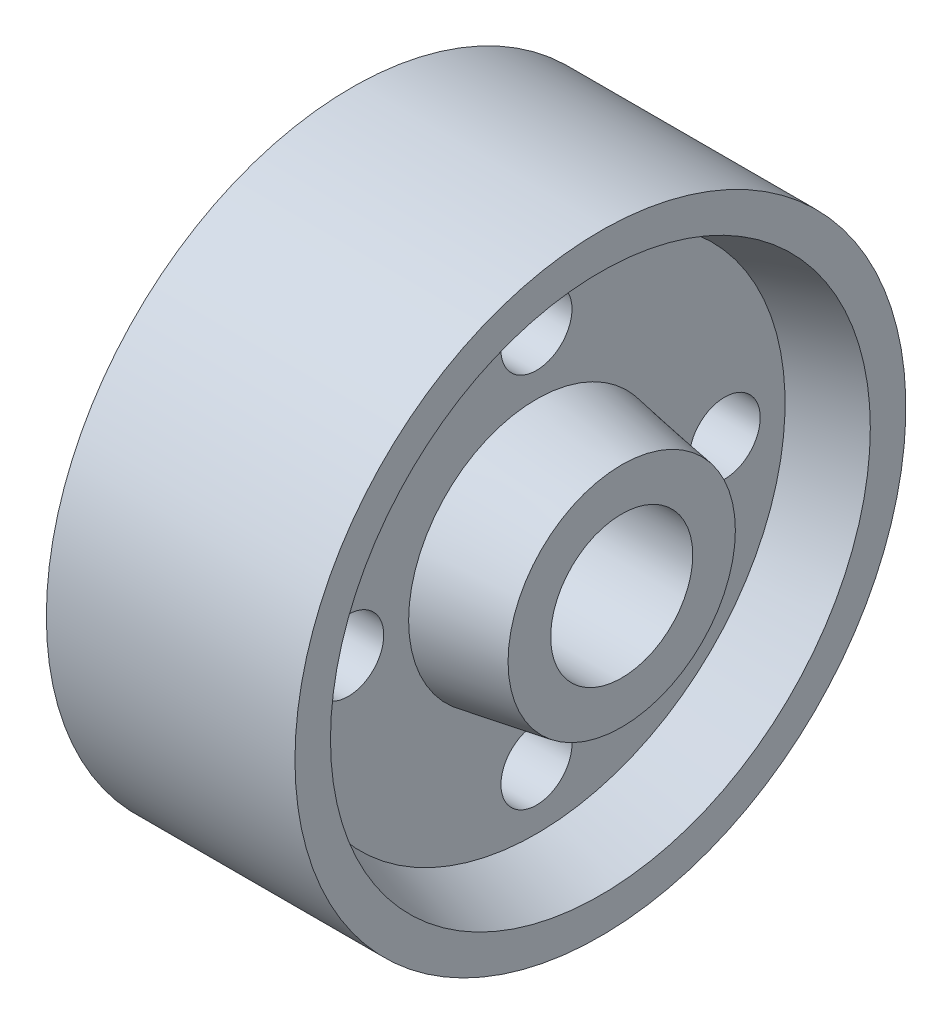
ISO-10303-21;
HEADER;
FILE_DESCRIPTION(('STEP AP214'),'2;1');
FILE_NAME('part.step','',(''),(''),'','','');
FILE_SCHEMA(('AUTOMOTIVE_DESIGN { 1 0 10303 214 1 1 1 1 }'));
ENDSEC;
DATA;
#1=APPLICATION_CONTEXT('core data for automotive mechanical design processes');
#2=APPLICATION_PROTOCOL_DEFINITION('international standard','automotive_design',2000,#1);
#3=PRODUCT_CONTEXT('',#1,'mechanical');
#4=PRODUCT('Part','Part','',(#3));
#5=PRODUCT_RELATED_PRODUCT_CATEGORY('part','',(#4));
#6=PRODUCT_DEFINITION_FORMATION('','',#4);
#7=PRODUCT_DEFINITION_CONTEXT('part definition',#1,'design');
#8=PRODUCT_DEFINITION('design','',#6,#7);
#9=PRODUCT_DEFINITION_SHAPE('','',#8);
#10=(LENGTH_UNIT() NAMED_UNIT(*) SI_UNIT(.MILLI.,.METRE.));
#11=(NAMED_UNIT(*) PLANE_ANGLE_UNIT() SI_UNIT($,.RADIAN.));
#12=(NAMED_UNIT(*) SI_UNIT($,.STERADIAN.) SOLID_ANGLE_UNIT());
#13=UNCERTAINTY_MEASURE_WITH_UNIT(LENGTH_MEASURE(1.E-05),#10,'distance_accuracy_value','');
#14=(GEOMETRIC_REPRESENTATION_CONTEXT(3) GLOBAL_UNCERTAINTY_ASSIGNED_CONTEXT((#13)) GLOBAL_UNIT_ASSIGNED_CONTEXT((#10,
#11,#12)) REPRESENTATION_CONTEXT('',''));
#15=CARTESIAN_POINT('',(0.,0.,0.));
#16=DIRECTION('',(0.,0.,1.));
#17=DIRECTION('',(1.,0.,0.));
#18=AXIS2_PLACEMENT_3D('',#15,#16,#17);
#19=CARTESIAN_POINT('',(41.,0.,0.));
#20=DIRECTION('',(-1.,0.,0.));
#21=DIRECTION('',(0.,0.,1.));
#22=AXIS2_PLACEMENT_3D('',#19,#20,#21);
#23=PLANE('',#22);
#24=CARTESIAN_POINT('',(41.,0.,0.));
#25=DIRECTION('',(1.,0.,0.));
#26=DIRECTION('',(0.,0.,-1.));
#27=AXIS2_PLACEMENT_3D('',#24,#25,#26);
#28=CIRCLE('',#27,10.);
#29=CARTESIAN_POINT('',(41.,0.,-10.));
#30=VERTEX_POINT('',#29);
#31=EDGE_CURVE('E174',#30,#30,#28,.T.);
#32=ORIENTED_EDGE('',*,*,#31,.F.);
#33=EDGE_LOOP('',(#32));
#34=FACE_BOUND('',#33,.T.);
#35=CARTESIAN_POINT('',(41.,0.,0.));
#36=DIRECTION('',(-1.,0.,0.));
#37=DIRECTION('',(0.,0.,1.));
#38=AXIS2_PLACEMENT_3D('',#35,#36,#37);
#39=CIRCLE('',#38,16.);
#40=CARTESIAN_POINT('',(41.,0.,16.));
#41=VERTEX_POINT('',#40);
#42=EDGE_CURVE('E10',#41,#41,#39,.T.);
#43=ORIENTED_EDGE('',*,*,#42,.F.);
#44=EDGE_LOOP('',(#43));
#45=FACE_BOUND('',#44,.T.);
#46=ADVANCED_FACE('F37',(#34,#45),#23,.F.);
#47=CARTESIAN_POINT('',(41.,0.,0.));
#48=DIRECTION('',(-1.,0.,0.));
#49=DIRECTION('',(0.,0.,1.));
#50=AXIS2_PLACEMENT_3D('',#47,#48,#49);
#51=CONICAL_SURFACE('',#50,16.,0.165148677414627);
#52=CARTESIAN_POINT('',(29.,0.,0.));
#53=DIRECTION('',(-1.,0.,0.));
#54=DIRECTION('',(0.,0.,1.));
#55=AXIS2_PLACEMENT_3D('',#52,#53,#54);
#56=CIRCLE('',#55,18.);
#57=CARTESIAN_POINT('',(29.,0.,18.));
#58=VERTEX_POINT('',#57);
#59=EDGE_CURVE('E44',#58,#58,#56,.T.);
#60=ORIENTED_EDGE('',*,*,#59,.F.);
#61=EDGE_LOOP('',(#60));
#62=FACE_BOUND('',#61,.T.);
#63=ORIENTED_EDGE('',*,*,#42,.T.);
#64=EDGE_LOOP('',(#63));
#65=FACE_BOUND('',#64,.T.);
#66=ADVANCED_FACE('F106',(#62,#65),#51,.T.);
#67=CARTESIAN_POINT('',(29.,0.,-18.));
#68=DIRECTION('',(-1.,0.,0.));
#69=DIRECTION('',(0.,0.,1.));
#70=AXIS2_PLACEMENT_3D('',#67,#68,#69);
#71=PLANE('',#70);
#72=CARTESIAN_POINT('',(29.,26.5,0.));
#73=DIRECTION('',(-1.,0.,0.));
#74=DIRECTION('',(0.,0.,1.));
#75=AXIS2_PLACEMENT_3D('',#72,#73,#74);
#76=CIRCLE('',#75,5.);
#77=CARTESIAN_POINT('',(29.,26.5,5.));
#78=VERTEX_POINT('',#77);
#79=EDGE_CURVE('E75',#78,#78,#76,.T.);
#80=ORIENTED_EDGE('',*,*,#79,.T.);
#81=EDGE_LOOP('',(#80));
#82=FACE_BOUND('',#81,.T.);
#83=CARTESIAN_POINT('',(29.,0.,-26.5));
#84=DIRECTION('',(-1.,0.,0.));
#85=DIRECTION('',(0.,0.,1.));
#86=AXIS2_PLACEMENT_3D('',#83,#84,#85);
#87=CIRCLE('',#86,4.99999999999992);
#88=CARTESIAN_POINT('',(29.,0.,-21.5000000000001));
#89=VERTEX_POINT('',#88);
#90=EDGE_CURVE('E63',#89,#89,#87,.T.);
#91=ORIENTED_EDGE('',*,*,#90,.T.);
#92=EDGE_LOOP('',(#91));
#93=FACE_BOUND('',#92,.T.);
#94=CARTESIAN_POINT('',(29.,-26.5,0.));
#95=DIRECTION('',(-1.,0.,0.));
#96=DIRECTION('',(0.,0.,1.));
#97=AXIS2_PLACEMENT_3D('',#94,#95,#96);
#98=CIRCLE('',#97,5.);
#99=CARTESIAN_POINT('',(29.,-26.5,4.99999999999999));
#100=VERTEX_POINT('',#99);
#101=EDGE_CURVE('E60',#100,#100,#98,.T.);
#102=ORIENTED_EDGE('',*,*,#101,.T.);
#103=EDGE_LOOP('',(#102));
#104=FACE_BOUND('',#103,.T.);
#105=CARTESIAN_POINT('',(29.,0.,26.5));
#106=DIRECTION('',(-1.,0.,0.));
#107=DIRECTION('',(0.,0.,1.));
#108=AXIS2_PLACEMENT_3D('',#105,#106,#107);
#109=CIRCLE('',#108,5.);
#110=CARTESIAN_POINT('',(29.,0.,31.5));
#111=VERTEX_POINT('',#110);
#112=EDGE_CURVE('E56',#111,#111,#109,.T.);
#113=ORIENTED_EDGE('',*,*,#112,.T.);
#114=EDGE_LOOP('',(#113));
#115=FACE_BOUND('',#114,.T.);
#116=CARTESIAN_POINT('',(29.,0.,0.));
#117=DIRECTION('',(-1.,0.,0.));
#118=DIRECTION('',(0.,0.,1.));
#119=AXIS2_PLACEMENT_3D('',#116,#117,#118);
#120=CIRCLE('',#119,35.);
#121=CARTESIAN_POINT('',(29.,0.,35.));
#122=VERTEX_POINT('',#121);
#123=EDGE_CURVE('E49',#122,#122,#120,.T.);
#124=ORIENTED_EDGE('',*,*,#123,.F.);
#125=EDGE_LOOP('',(#124));
#126=FACE_BOUND('',#125,.T.);
#127=ORIENTED_EDGE('',*,*,#59,.T.);
#128=EDGE_LOOP('',(#127));
#129=FACE_BOUND('',#128,.T.);
#130=ADVANCED_FACE('F103',(#82,#93,#104,#115,#126,#129),#71,.F.);
#131=CARTESIAN_POINT('',(29.,0.,0.));
#132=DIRECTION('',(1.,0.,0.));
#133=DIRECTION('',(0.,0.,-1.));
#134=AXIS2_PLACEMENT_3D('',#131,#132,#133);
#135=CONICAL_SURFACE('',#134,35.,0.321750554396642);
#136=CARTESIAN_POINT('',(38.,0.,0.));
#137=DIRECTION('',(-1.,0.,0.));
#138=DIRECTION('',(0.,0.,1.));
#139=AXIS2_PLACEMENT_3D('',#136,#137,#138);
#140=CIRCLE('',#139,38.);
#141=CARTESIAN_POINT('',(38.,0.,38.));
#142=VERTEX_POINT('',#141);
#143=EDGE_CURVE('E96',#142,#142,#140,.T.);
#144=ORIENTED_EDGE('',*,*,#143,.F.);
#145=EDGE_LOOP('',(#144));
#146=FACE_BOUND('',#145,.T.);
#147=ORIENTED_EDGE('',*,*,#123,.T.);
#148=EDGE_LOOP('',(#147));
#149=FACE_BOUND('',#148,.T.);
#150=ADVANCED_FACE('F101',(#146,#149),#135,.F.);
#151=CARTESIAN_POINT('',(38.,0.,-38.));
#152=DIRECTION('',(-1.,0.,0.));
#153=DIRECTION('',(0.,0.,1.));
#154=AXIS2_PLACEMENT_3D('',#151,#152,#153);
#155=PLANE('',#154);
#156=CARTESIAN_POINT('',(38.,0.,0.));
#157=DIRECTION('',(-1.,0.,0.));
#158=DIRECTION('',(0.,0.,1.));
#159=AXIS2_PLACEMENT_3D('',#156,#157,#158);
#160=CIRCLE('',#159,43.);
#161=CARTESIAN_POINT('',(38.,0.,43.));
#162=VERTEX_POINT('',#161);
#163=EDGE_CURVE('E93',#162,#162,#160,.T.);
#164=ORIENTED_EDGE('',*,*,#163,.F.);
#165=EDGE_LOOP('',(#164));
#166=FACE_BOUND('',#165,.T.);
#167=ORIENTED_EDGE('',*,*,#143,.T.);
#168=EDGE_LOOP('',(#167));
#169=FACE_BOUND('',#168,.T.);
#170=ADVANCED_FACE('F119',(#166,#169),#155,.F.);
#171=CARTESIAN_POINT('',(0.,0.,0.));
#172=DIRECTION('',(-1.,0.,0.));
#173=DIRECTION('',(0.,0.,1.));
#174=AXIS2_PLACEMENT_3D('',#171,#172,#173);
#175=CYLINDRICAL_SURFACE('',#174,43.);
#176=CARTESIAN_POINT('',(3.,0.,0.));
#177=DIRECTION('',(-1.,0.,0.));
#178=DIRECTION('',(0.,0.,1.));
#179=AXIS2_PLACEMENT_3D('',#176,#177,#178);
#180=CIRCLE('',#179,43.);
#181=CARTESIAN_POINT('',(3.,0.,43.));
#182=VERTEX_POINT('',#181);
#183=EDGE_CURVE('E90',#182,#182,#180,.T.);
#184=ORIENTED_EDGE('',*,*,#183,.F.);
#185=EDGE_LOOP('',(#184));
#186=FACE_BOUND('',#185,.T.);
#187=ORIENTED_EDGE('',*,*,#163,.T.);
#188=EDGE_LOOP('',(#187));
#189=FACE_BOUND('',#188,.T.);
#190=ADVANCED_FACE('F123',(#186,#189),#175,.T.);
#191=CARTESIAN_POINT('',(3.,0.,-38.));
#192=DIRECTION('',(1.,0.,0.));
#193=DIRECTION('',(0.,0.,-1.));
#194=AXIS2_PLACEMENT_3D('',#191,#192,#193);
#195=PLANE('',#194);
#196=CARTESIAN_POINT('',(3.,0.,0.));
#197=DIRECTION('',(-1.,0.,0.));
#198=DIRECTION('',(0.,0.,1.));
#199=AXIS2_PLACEMENT_3D('',#196,#197,#198);
#200=CIRCLE('',#199,38.);
#201=CARTESIAN_POINT('',(3.,0.,38.));
#202=VERTEX_POINT('',#201);
#203=EDGE_CURVE('E87',#202,#202,#200,.T.);
#204=ORIENTED_EDGE('',*,*,#203,.F.);
#205=EDGE_LOOP('',(#204));
#206=FACE_BOUND('',#205,.T.);
#207=ORIENTED_EDGE('',*,*,#183,.T.);
#208=EDGE_LOOP('',(#207));
#209=FACE_BOUND('',#208,.T.);
#210=ADVANCED_FACE('F127',(#206,#209),#195,.F.);
#211=CARTESIAN_POINT('',(3.,0.,0.));
#212=DIRECTION('',(-1.,0.,0.));
#213=DIRECTION('',(0.,0.,1.));
#214=AXIS2_PLACEMENT_3D('',#211,#212,#213);
#215=CONICAL_SURFACE('',#214,38.,0.321750554396642);
#216=CARTESIAN_POINT('',(12.,0.,0.));
#217=DIRECTION('',(-1.,0.,0.));
#218=DIRECTION('',(0.,0.,1.));
#219=AXIS2_PLACEMENT_3D('',#216,#217,#218);
#220=CIRCLE('',#219,35.);
#221=CARTESIAN_POINT('',(12.,0.,35.));
#222=VERTEX_POINT('',#221);
#223=EDGE_CURVE('E84',#222,#222,#220,.T.);
#224=ORIENTED_EDGE('',*,*,#223,.F.);
#225=EDGE_LOOP('',(#224));
#226=FACE_BOUND('',#225,.T.);
#227=ORIENTED_EDGE('',*,*,#203,.T.);
#228=EDGE_LOOP('',(#227));
#229=FACE_BOUND('',#228,.T.);
#230=ADVANCED_FACE('F131',(#226,#229),#215,.F.);
#231=CARTESIAN_POINT('',(12.,0.,-18.));
#232=DIRECTION('',(1.,0.,0.));
#233=DIRECTION('',(0.,0.,-1.));
#234=AXIS2_PLACEMENT_3D('',#231,#232,#233);
#235=PLANE('',#234);
#236=CARTESIAN_POINT('',(12.,26.5,0.));
#237=DIRECTION('',(1.,0.,0.));
#238=DIRECTION('',(0.,0.,-1.));
#239=AXIS2_PLACEMENT_3D('',#236,#237,#238);
#240=CIRCLE('',#239,5.);
#241=CARTESIAN_POINT('',(12.,26.5,-5.));
#242=VERTEX_POINT('',#241);
#243=EDGE_CURVE('E40',#242,#242,#240,.T.);
#244=ORIENTED_EDGE('',*,*,#243,.T.);
#245=EDGE_LOOP('',(#244));
#246=FACE_BOUND('',#245,.T.);
#247=CARTESIAN_POINT('',(12.,0.,-26.5));
#248=DIRECTION('',(1.,0.,0.));
#249=DIRECTION('',(0.,0.,-1.));
#250=AXIS2_PLACEMENT_3D('',#247,#248,#249);
#251=CIRCLE('',#250,4.99999999999992);
#252=CARTESIAN_POINT('',(12.,0.,-31.4999999999999));
#253=VERTEX_POINT('',#252);
#254=EDGE_CURVE('E61',#253,#253,#251,.T.);
#255=ORIENTED_EDGE('',*,*,#254,.T.);
#256=EDGE_LOOP('',(#255));
#257=FACE_BOUND('',#256,.T.);
#258=CARTESIAN_POINT('',(12.,-26.5,0.));
#259=DIRECTION('',(1.,0.,0.));
#260=DIRECTION('',(0.,0.,-1.));
#261=AXIS2_PLACEMENT_3D('',#258,#259,#260);
#262=CIRCLE('',#261,5.);
#263=CARTESIAN_POINT('',(12.,-26.5,-5.00000000000002));
#264=VERTEX_POINT('',#263);
#265=EDGE_CURVE('E58',#264,#264,#262,.T.);
#266=ORIENTED_EDGE('',*,*,#265,.T.);
#267=EDGE_LOOP('',(#266));
#268=FACE_BOUND('',#267,.T.);
#269=CARTESIAN_POINT('',(12.,0.,26.5));
#270=DIRECTION('',(1.,0.,0.));
#271=DIRECTION('',(0.,0.,-1.));
#272=AXIS2_PLACEMENT_3D('',#269,#270,#271);
#273=CIRCLE('',#272,5.);
#274=CARTESIAN_POINT('',(12.,0.,21.5));
#275=VERTEX_POINT('',#274);
#276=EDGE_CURVE('E53',#275,#275,#273,.T.);
#277=ORIENTED_EDGE('',*,*,#276,.T.);
#278=EDGE_LOOP('',(#277));
#279=FACE_BOUND('',#278,.T.);
#280=CARTESIAN_POINT('',(12.,0.,0.));
#281=DIRECTION('',(-1.,0.,0.));
#282=DIRECTION('',(0.,0.,1.));
#283=AXIS2_PLACEMENT_3D('',#280,#281,#282);
#284=CIRCLE('',#283,18.);
#285=CARTESIAN_POINT('',(12.,0.,18.));
#286=VERTEX_POINT('',#285);
#287=EDGE_CURVE('E81',#286,#286,#284,.T.);
#288=ORIENTED_EDGE('',*,*,#287,.F.);
#289=EDGE_LOOP('',(#288));
#290=FACE_BOUND('',#289,.T.);
#291=ORIENTED_EDGE('',*,*,#223,.T.);
#292=EDGE_LOOP('',(#291));
#293=FACE_BOUND('',#292,.T.);
#294=ADVANCED_FACE('F135',(#246,#257,#268,#279,#290,#293),#235,.F.);
#295=CARTESIAN_POINT('',(12.,0.,0.));
#296=DIRECTION('',(1.,0.,0.));
#297=DIRECTION('',(0.,0.,-1.));
#298=AXIS2_PLACEMENT_3D('',#295,#296,#297);
#299=CONICAL_SURFACE('',#298,18.,0.165148677414627);
#300=CARTESIAN_POINT('',(0.,0.,0.));
#301=DIRECTION('',(-1.,0.,0.));
#302=DIRECTION('',(0.,0.,1.));
#303=AXIS2_PLACEMENT_3D('',#300,#301,#302);
#304=CIRCLE('',#303,16.);
#305=CARTESIAN_POINT('',(0.,0.,16.));
#306=VERTEX_POINT('',#305);
#307=EDGE_CURVE('E78',#306,#306,#304,.T.);
#308=ORIENTED_EDGE('',*,*,#307,.F.);
#309=EDGE_LOOP('',(#308));
#310=FACE_BOUND('',#309,.T.);
#311=ORIENTED_EDGE('',*,*,#287,.T.);
#312=EDGE_LOOP('',(#311));
#313=FACE_BOUND('',#312,.T.);
#314=ADVANCED_FACE('F139',(#310,#313),#299,.T.);
#315=CARTESIAN_POINT('',(0.,0.,0.));
#316=DIRECTION('',(1.,0.,0.));
#317=DIRECTION('',(0.,0.,-1.));
#318=AXIS2_PLACEMENT_3D('',#315,#316,#317);
#319=PLANE('',#318);
#320=CARTESIAN_POINT('',(0.,0.,0.));
#321=DIRECTION('',(1.,0.,0.));
#322=DIRECTION('',(0.,0.,-1.));
#323=AXIS2_PLACEMENT_3D('',#320,#321,#322);
#324=CIRCLE('',#323,10.);
#325=CARTESIAN_POINT('',(0.,0.,-10.));
#326=VERTEX_POINT('',#325);
#327=EDGE_CURVE('E57',#326,#326,#324,.T.);
#328=ORIENTED_EDGE('',*,*,#327,.T.);
#329=EDGE_LOOP('',(#328));
#330=FACE_BOUND('',#329,.T.);
#331=ORIENTED_EDGE('',*,*,#307,.T.);
#332=EDGE_LOOP('',(#331));
#333=FACE_BOUND('',#332,.T.);
#334=ADVANCED_FACE('F143',(#330,#333),#319,.F.);
#335=CARTESIAN_POINT('',(0.,0.,26.5));
#336=DIRECTION('',(1.,0.,0.));
#337=DIRECTION('',(0.,0.,-1.));
#338=AXIS2_PLACEMENT_3D('',#335,#336,#337);
#339=CYLINDRICAL_SURFACE('',#338,5.);
#340=ORIENTED_EDGE('',*,*,#276,.F.);
#341=EDGE_LOOP('',(#340));
#342=FACE_BOUND('',#341,.T.);
#343=ORIENTED_EDGE('',*,*,#112,.F.);
#344=EDGE_LOOP('',(#343));
#345=FACE_BOUND('',#344,.T.);
#346=ADVANCED_FACE('F147',(#342,#345),#339,.F.);
#347=CARTESIAN_POINT('',(0.,-26.5,0.));
#348=DIRECTION('',(1.,0.,0.));
#349=DIRECTION('',(0.,0.,-1.));
#350=AXIS2_PLACEMENT_3D('',#347,#348,#349);
#351=CYLINDRICAL_SURFACE('',#350,5.);
#352=ORIENTED_EDGE('',*,*,#265,.F.);
#353=EDGE_LOOP('',(#352));
#354=FACE_BOUND('',#353,.T.);
#355=ORIENTED_EDGE('',*,*,#101,.F.);
#356=EDGE_LOOP('',(#355));
#357=FACE_BOUND('',#356,.T.);
#358=ADVANCED_FACE('F151',(#354,#357),#351,.F.);
#359=CARTESIAN_POINT('',(0.,0.,-26.5));
#360=DIRECTION('',(1.,0.,0.));
#361=DIRECTION('',(0.,0.,-1.));
#362=AXIS2_PLACEMENT_3D('',#359,#360,#361);
#363=CYLINDRICAL_SURFACE('',#362,4.99999999999992);
#364=ORIENTED_EDGE('',*,*,#254,.F.);
#365=EDGE_LOOP('',(#364));
#366=FACE_BOUND('',#365,.T.);
#367=ORIENTED_EDGE('',*,*,#90,.F.);
#368=EDGE_LOOP('',(#367));
#369=FACE_BOUND('',#368,.T.);
#370=ADVANCED_FACE('F155',(#366,#369),#363,.F.);
#371=CARTESIAN_POINT('',(0.,26.5,0.));
#372=DIRECTION('',(1.,0.,0.));
#373=DIRECTION('',(0.,0.,-1.));
#374=AXIS2_PLACEMENT_3D('',#371,#372,#373);
#375=CYLINDRICAL_SURFACE('',#374,5.);
#376=ORIENTED_EDGE('',*,*,#243,.F.);
#377=EDGE_LOOP('',(#376));
#378=FACE_BOUND('',#377,.T.);
#379=ORIENTED_EDGE('',*,*,#79,.F.);
#380=EDGE_LOOP('',(#379));
#381=FACE_BOUND('',#380,.T.);
#382=ADVANCED_FACE('F159',(#378,#381),#375,.F.);
#383=CARTESIAN_POINT('',(0.,0.,0.));
#384=DIRECTION('',(1.,0.,0.));
#385=DIRECTION('',(0.,0.,-1.));
#386=AXIS2_PLACEMENT_3D('',#383,#384,#385);
#387=CYLINDRICAL_SURFACE('',#386,10.);
#388=ORIENTED_EDGE('',*,*,#327,.F.);
#389=EDGE_LOOP('',(#388));
#390=FACE_BOUND('',#389,.T.);
#391=ORIENTED_EDGE('',*,*,#31,.T.);
#392=EDGE_LOOP('',(#391));
#393=FACE_BOUND('',#392,.T.);
#394=ADVANCED_FACE('F163',(#390,#393),#387,.F.);
#395=CLOSED_SHELL('',(#46,#66,#130,#150,#170,#190,#210,#230,#294,#314,#334,#346,#358,#370,#382,#394));
#396=MANIFOLD_SOLID_BREP('B2',#395);
#397=ADVANCED_BREP_SHAPE_REPRESENTATION('',(#18,#396),#14);
#398=SHAPE_DEFINITION_REPRESENTATION(#9,#397);
ENDSEC;
END-ISO-10303-21;
